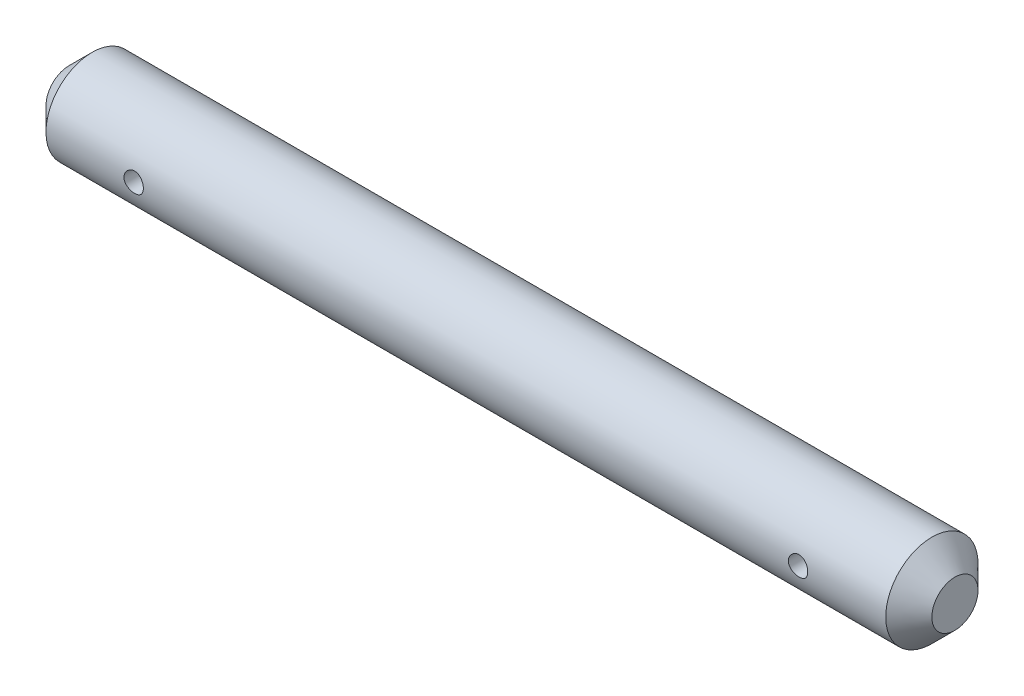
ISO-10303-21;
HEADER;
FILE_DESCRIPTION(('STEP AP214'),'2;1');
FILE_NAME('part.step','',(''),(''),'','','');
FILE_SCHEMA(('AUTOMOTIVE_DESIGN { 1 0 10303 214 1 1 1 1 }'));
ENDSEC;
DATA;
#1=APPLICATION_CONTEXT('core data for automotive mechanical design processes');
#2=APPLICATION_PROTOCOL_DEFINITION('international standard','automotive_design',2000,#1);
#3=PRODUCT_CONTEXT('',#1,'mechanical');
#4=PRODUCT('Part','Part','',(#3));
#5=PRODUCT_RELATED_PRODUCT_CATEGORY('part','',(#4));
#6=PRODUCT_DEFINITION_FORMATION('','',#4);
#7=PRODUCT_DEFINITION_CONTEXT('part definition',#1,'design');
#8=PRODUCT_DEFINITION('design','',#6,#7);
#9=PRODUCT_DEFINITION_SHAPE('','',#8);
#10=(LENGTH_UNIT() NAMED_UNIT(*) SI_UNIT(.MILLI.,.METRE.));
#11=(NAMED_UNIT(*) PLANE_ANGLE_UNIT() SI_UNIT($,.RADIAN.));
#12=(NAMED_UNIT(*) SI_UNIT($,.STERADIAN.) SOLID_ANGLE_UNIT());
#13=UNCERTAINTY_MEASURE_WITH_UNIT(LENGTH_MEASURE(1.E-05),#10,'distance_accuracy_value','');
#14=(GEOMETRIC_REPRESENTATION_CONTEXT(3) GLOBAL_UNCERTAINTY_ASSIGNED_CONTEXT((#13)) GLOBAL_UNIT_ASSIGNED_CONTEXT((#10,
#11,#12)) REPRESENTATION_CONTEXT('',''));
#15=CARTESIAN_POINT('',(0.,0.,0.));
#16=DIRECTION('',(0.,0.,1.));
#17=DIRECTION('',(1.,0.,0.));
#18=AXIS2_PLACEMENT_3D('',#15,#16,#17);
#19=CARTESIAN_POINT('',(-48.,0.,0.));
#20=DIRECTION('',(-1.,0.,0.));
#21=DIRECTION('',(0.,-1.,0.));
#22=AXIS2_PLACEMENT_3D('',#19,#20,#21);
#23=CYLINDRICAL_SURFACE('',#22,5.);
#24=CARTESIAN_POINT('',(45.5,0.,0.));
#25=DIRECTION('',(1.,0.,0.));
#26=DIRECTION('',(0.,1.,0.));
#27=AXIS2_PLACEMENT_3D('',#24,#25,#26);
#28=CIRCLE('',#27,5.);
#29=CARTESIAN_POINT('',(45.5,5.,0.));
#30=VERTEX_POINT('',#29);
#31=EDGE_CURVE('E51',#30,#30,#28,.F.);
#32=ORIENTED_EDGE('',*,*,#31,.T.);
#33=EDGE_LOOP('',(#32));
#34=FACE_BOUND('',#33,.T.);
#35=CARTESIAN_POINT('',(-45.5,0.,0.));
#36=DIRECTION('',(1.,0.,0.));
#37=DIRECTION('',(0.,1.,0.));
#38=AXIS2_PLACEMENT_3D('',#35,#36,#37);
#39=CIRCLE('',#38,5.);
#40=CARTESIAN_POINT('',(-45.5,5.,0.));
#41=VERTEX_POINT('',#40);
#42=EDGE_CURVE('E55',#41,#41,#39,.T.);
#43=ORIENTED_EDGE('',*,*,#42,.T.);
#44=EDGE_LOOP('',(#43));
#45=FACE_BOUND('',#44,.T.);
#46=CARTESIAN_POINT('',(34.95,0.,-5.));
#47=CARTESIAN_POINT('',(34.9500020670795,-0.0582929242366829,-4.99999892087414));
#48=CARTESIAN_POINT('',(34.9548707746513,-0.116611365509768,-4.99897017169846));
#49=CARTESIAN_POINT('',(34.9741990173519,-0.23159558425754,-4.99496558613183));
#50=CARTESIAN_POINT('',(34.9886657708544,-0.288260084347119,-4.99198828432158));
#51=CARTESIAN_POINT('',(35.0267200745913,-0.3982576954319,-4.98441855072821));
#52=CARTESIAN_POINT('',(35.0502984725063,-0.451594087150226,-4.97982774007421));
#53=CARTESIAN_POINT('',(35.1058785820746,-0.553551149056712,-4.9695281714379));
#54=CARTESIAN_POINT('',(35.1378799416124,-0.602172016257581,-4.96381946019113));
#55=CARTESIAN_POINT('',(35.2099011419673,-0.694042951461575,-4.95181603197298));
#56=CARTESIAN_POINT('',(35.2500220614324,-0.737212900277577,-4.9455145252722));
#57=CARTESIAN_POINT('',(35.336926357596,-0.816262310202856,-4.93308430111514));
#58=CARTESIAN_POINT('',(35.3837102916704,-0.852141160785579,-4.92695559816572));
#59=CARTESIAN_POINT('',(35.4831973295141,-0.915937457501272,-4.91549827175981));
#60=CARTESIAN_POINT('',(35.5359555086942,-0.943770721272677,-4.91017836622675));
#61=CARTESIAN_POINT('',(35.6455301548892,-0.990146102507814,-4.90103795609041));
#62=CARTESIAN_POINT('',(35.7023461764008,-1.00868923813218,-4.89721728718677));
#63=CARTESIAN_POINT('',(35.8175579304258,-1.03569542997195,-4.89157688337261));
#64=CARTESIAN_POINT('',(35.8759191533494,-1.04429973598509,-4.88972913880302));
#65=CARTESIAN_POINT('',(35.9932837965518,-1.05162300397034,-4.88815958427772));
#66=CARTESIAN_POINT('',(36.052287143505,-1.05034308305975,-4.88843753407558));
#67=CARTESIAN_POINT('',(36.1682190613358,-1.03804815221598,-4.89106256175169));
#68=CARTESIAN_POINT('',(36.225165826753,-1.02719619088078,-4.89337498308973));
#69=CARTESIAN_POINT('',(36.3364120546769,-0.996323090753519,-4.89975371630493));
#70=CARTESIAN_POINT('',(36.3907113789727,-0.976301473821875,-4.90382011964053));
#71=CARTESIAN_POINT('',(36.4955852132004,-0.927504854980543,-4.91328339659489));
#72=CARTESIAN_POINT('',(36.5461292215821,-0.898666240724584,-4.91868988305607));
#73=CARTESIAN_POINT('',(36.6417213485943,-0.833099050287869,-4.93021812634629));
#74=CARTESIAN_POINT('',(36.6867687727047,-0.796369478661749,-4.93633997337369));
#75=CARTESIAN_POINT('',(36.7710287413324,-0.715195179306919,-4.94875854842759));
#76=CARTESIAN_POINT('',(36.8101074445863,-0.67061155714214,-4.95505633328249));
#77=CARTESIAN_POINT('',(36.8802539351438,-0.575453612067676,-4.96700603272251));
#78=CARTESIAN_POINT('',(36.9113215984944,-0.524879196481373,-4.97265793731329));
#79=CARTESIAN_POINT('',(36.9645931993866,-0.419018933981055,-4.98269521140964));
#80=CARTESIAN_POINT('',(36.9867806671355,-0.363724561359624,-4.98707822341839));
#81=CARTESIAN_POINT('',(37.0215130492623,-0.250080252056762,-4.99406618254208));
#82=CARTESIAN_POINT('',(37.0340592539025,-0.191730725354514,-4.99667136757323));
#83=CARTESIAN_POINT('',(37.0489607717464,-0.0747814806285939,-4.9997766226025));
#84=CARTESIAN_POINT('',(37.0514990709266,-0.0162060522941173,-5.00031448713233));
#85=CARTESIAN_POINT('',(37.0468071881703,0.100531867341577,-4.99932996439547));
#86=CARTESIAN_POINT('',(37.039577614451,0.158694384126915,-4.99780770540671));
#87=CARTESIAN_POINT('',(37.015707092173,0.272356774731822,-4.99289773376416));
#88=CARTESIAN_POINT('',(36.9991611274063,0.327877481794109,-4.9895288570548));
#89=CARTESIAN_POINT('',(36.9572321505231,0.435355996370233,-4.98130233491784));
#90=CARTESIAN_POINT('',(36.9318484273929,0.487313516816587,-4.97644456971024));
#91=CARTESIAN_POINT('',(36.8725762854505,0.586954628019342,-4.96568540679325));
#92=CARTESIAN_POINT('',(36.8385790946396,0.634572076596089,-4.95977097058188));
#93=CARTESIAN_POINT('',(36.7631894442566,0.723491820275091,-4.94758298765372));
#94=CARTESIAN_POINT('',(36.7217961044215,0.764793362593854,-4.94130939825228));
#95=CARTESIAN_POINT('',(36.6319525545589,0.840624189826654,-4.9289811250728));
#96=CARTESIAN_POINT('',(36.5833949340224,0.875027268233335,-4.92293193044843));
#97=CARTESIAN_POINT('',(36.4810830724301,0.935190004312763,-4.9118590398142));
#98=CARTESIAN_POINT('',(36.4273290493812,0.96095002438902,-4.90683530081044));
#99=CARTESIAN_POINT('',(36.316431644652,1.00292882698657,-4.89842756340699));
#100=CARTESIAN_POINT('',(36.2593086075525,1.01919948621189,-4.89503466774294));
#101=CARTESIAN_POINT('',(36.1430596491353,1.04189240556228,-4.89025532411004));
#102=CARTESIAN_POINT('',(36.0839340208586,1.04831610029383,-4.88886858386559));
#103=CARTESIAN_POINT('',(35.9666281054558,1.05107544496626,-4.88827594643399));
#104=CARTESIAN_POINT('',(35.9084526451606,1.04761086244724,-4.88902686253059));
#105=CARTESIAN_POINT('',(35.7935339467898,1.03113587744834,-4.89252781964505));
#106=CARTESIAN_POINT('',(35.7367906944967,1.01812556976794,-4.89527784080961));
#107=CARTESIAN_POINT('',(35.6264907935825,0.983021491745314,-4.90244691845734));
#108=CARTESIAN_POINT('',(35.5729252418772,0.960954619313949,-4.90686102947481));
#109=CARTESIAN_POINT('',(35.4702262627923,0.908387766965595,-4.91686326664018));
#110=CARTESIAN_POINT('',(35.4210932554725,0.877886988901934,-4.92245150389004));
#111=CARTESIAN_POINT('',(35.3276645094141,0.808646148896298,-4.93430284377157));
#112=CARTESIAN_POINT('',(35.2834762916322,0.76976280292096,-4.94057660404644));
#113=CARTESIAN_POINT('',(35.202186156234,0.685153613351451,-4.95301820370576));
#114=CARTESIAN_POINT('',(35.1650858731601,0.639426195777585,-4.95918601836046));
#115=CARTESIAN_POINT('',(35.0986097957516,0.541779863622078,-4.97080655544604));
#116=CARTESIAN_POINT('',(35.0693299290349,0.489794486766691,-4.9762500197256));
#117=CARTESIAN_POINT('',(35.0199691531916,0.381538980665326,-4.98571655366597));
#118=CARTESIAN_POINT('',(34.9998802525838,0.325272623547498,-4.98974085657711));
#119=CARTESIAN_POINT('',(34.9732006947065,0.224096334074654,-4.99516703145466));
#120=CARTESIAN_POINT('',(34.9645165085656,0.179747916168574,-4.99696846689598));
#121=CARTESIAN_POINT('',(34.9529154705435,0.0902714134666893,-4.99938534645405));
#122=CARTESIAN_POINT('',(34.9499983992069,0.0451433584042559,-5.00000083569946));
#123=CARTESIAN_POINT('',(34.95,0.,-5.));
#124=B_SPLINE_CURVE_WITH_KNOTS('',3,(#46,#47,#48,#49,#50,#51,#52,#53,#54,#55,#56,#57,#58,#59,
#60,#61,#62,#63,#64,#65,#66,#67,#68,#69,#70,#71,#72,#73,#74,#75,#76,#77,#78,#79,#80,#81,#82,#83,
#84,#85,#86,#87,#88,#89,#90,#91,#92,#93,#94,#95,#96,#97,#98,#99,#100,#101,#102,#103,#104,#105,
#106,#107,#108,#109,#110,#111,#112,#113,#114,#115,#116,#117,#118,#119,#120,#121,#122,#123),
.UNSPECIFIED.,.T.,.F.,(4,2,2,2,2,2,2,2,2,2,2,2,2,2,2,2,2,2,2,2,2,2,2,2,2,2,2,2,2,2,2,2,2,2,2,2,
2,2,4),(0.,0.174713575706853,0.349558696902308,0.524228647051034,0.698891296413362,
0.875879239345658,1.05288199641852,1.23167476707106,1.41044793846714,1.58664786689212,
1.76282788145741,1.93606360589124,2.10930836450166,2.28383377579595,2.45838121643624,
2.6363995863867,2.81442071061265,2.99277049128035,3.17109639975504,3.346146221126,
3.52118514315412,3.69447098177818,3.86777076478325,4.0433787480044,4.21900764539434,
4.39760379438033,4.57619245389215,4.7537954199357,4.93137250850286,5.10538764852306,
5.27940106040607,5.45290135168345,5.62641806786615,5.8031764972915,5.97997563974631,
6.15885305066524,6.3375746319438,6.47288192379533,6.60818406671408),.UNSPECIFIED.);
#125=CARTESIAN_POINT('',(34.95,0.,-5.));
#126=VERTEX_POINT('',#125);
#127=EDGE_CURVE('E74',#126,#126,#124,.T.);
#128=ORIENTED_EDGE('',*,*,#127,.T.);
#129=EDGE_LOOP('',(#128));
#130=FACE_BOUND('',#129,.T.);
#131=CARTESIAN_POINT('',(-37.05,0.,-4.99999999999999));
#132=CARTESIAN_POINT('',(-37.0499979329205,-0.0582929242366822,-4.99999892087414));
#133=CARTESIAN_POINT('',(-37.0451292253487,-0.116611365509767,-4.99897017169845));
#134=CARTESIAN_POINT('',(-37.0258009826481,-0.23159558425754,-4.99496558613183));
#135=CARTESIAN_POINT('',(-37.0113342291455,-0.288260084347119,-4.99198828432158));
#136=CARTESIAN_POINT('',(-36.9732799254087,-0.3982576954319,-4.98441855072821));
#137=CARTESIAN_POINT('',(-36.9497015274937,-0.451594087150225,-4.97982774007421));
#138=CARTESIAN_POINT('',(-36.8941214179254,-0.553551149056712,-4.9695281714379));
#139=CARTESIAN_POINT('',(-36.8621200583876,-0.602172016257581,-4.96381946019113));
#140=CARTESIAN_POINT('',(-36.7900988580327,-0.694042951461576,-4.95181603197298));
#141=CARTESIAN_POINT('',(-36.7499779385675,-0.737212900277579,-4.9455145252722));
#142=CARTESIAN_POINT('',(-36.663073642404,-0.816262310202857,-4.93308430111514));
#143=CARTESIAN_POINT('',(-36.6162897083296,-0.852141160785579,-4.92695559816572));
#144=CARTESIAN_POINT('',(-36.5168026704859,-0.915937457501271,-4.91549827175981));
#145=CARTESIAN_POINT('',(-36.4640444913058,-0.943770721272677,-4.91017836622675));
#146=CARTESIAN_POINT('',(-36.3544698451108,-0.990146102507813,-4.90103795609041));
#147=CARTESIAN_POINT('',(-36.2976538235992,-1.00868923813218,-4.89721728718677));
#148=CARTESIAN_POINT('',(-36.1824420695742,-1.03569542997195,-4.89157688337261));
#149=CARTESIAN_POINT('',(-36.1240808466506,-1.04429973598509,-4.88972913880302));
#150=CARTESIAN_POINT('',(-36.0067162034481,-1.05162300397034,-4.88815958427772));
#151=CARTESIAN_POINT('',(-35.947712856495,-1.05034308305975,-4.88843753407558));
#152=CARTESIAN_POINT('',(-35.8317809386642,-1.03804815221598,-4.89106256175169));
#153=CARTESIAN_POINT('',(-35.774834173247,-1.02719619088078,-4.89337498308973));
#154=CARTESIAN_POINT('',(-35.6635879453231,-0.996323090753518,-4.89975371630493));
#155=CARTESIAN_POINT('',(-35.6092886210273,-0.976301473821874,-4.90382011964053));
#156=CARTESIAN_POINT('',(-35.5044147867996,-0.927504854980542,-4.91328339659489));
#157=CARTESIAN_POINT('',(-35.4538707784179,-0.898666240724583,-4.91868988305607));
#158=CARTESIAN_POINT('',(-35.3582786514057,-0.833099050287868,-4.93021812634629));
#159=CARTESIAN_POINT('',(-35.3132312272953,-0.796369478661749,-4.93633997337369));
#160=CARTESIAN_POINT('',(-35.2289712586676,-0.715195179306918,-4.9487585484276));
#161=CARTESIAN_POINT('',(-35.1898925554137,-0.670611557142139,-4.95505633328249));
#162=CARTESIAN_POINT('',(-35.1197460648562,-0.575453612067675,-4.96700603272251));
#163=CARTESIAN_POINT('',(-35.0886784015056,-0.524879196481372,-4.97265793731329));
#164=CARTESIAN_POINT('',(-35.0354068006134,-0.419018933981054,-4.98269521140964));
#165=CARTESIAN_POINT('',(-35.0132193328645,-0.363724561359623,-4.98707822341839));
#166=CARTESIAN_POINT('',(-34.9784869507377,-0.250080252056761,-4.99406618254208));
#167=CARTESIAN_POINT('',(-34.9659407460975,-0.191730725354513,-4.99667136757323));
#168=CARTESIAN_POINT('',(-34.9510392282536,-0.0747814806285926,-4.9997766226025));
#169=CARTESIAN_POINT('',(-34.9485009290734,-0.0162060522941158,-5.00031448713233));
#170=CARTESIAN_POINT('',(-34.9531928118297,0.100531867341579,-4.99932996439547));
#171=CARTESIAN_POINT('',(-34.960422385549,0.158694384126917,-4.99780770540671));
#172=CARTESIAN_POINT('',(-34.984292907827,0.272356774731823,-4.99289773376416));
#173=CARTESIAN_POINT('',(-35.0008388725937,0.327877481794112,-4.9895288570548));
#174=CARTESIAN_POINT('',(-35.0427678494769,0.435355996370235,-4.98130233491784));
#175=CARTESIAN_POINT('',(-35.0681515726071,0.487313516816589,-4.97644456971024));
#176=CARTESIAN_POINT('',(-35.1274237145495,0.586954628019345,-4.96568540679325));
#177=CARTESIAN_POINT('',(-35.1614209053604,0.634572076596095,-4.95977097058188));
#178=CARTESIAN_POINT('',(-35.2368105557434,0.723491820275097,-4.94758298765372));
#179=CARTESIAN_POINT('',(-35.2782038955785,0.764793362593858,-4.94130939825228));
#180=CARTESIAN_POINT('',(-35.3680474454411,0.840624189826656,-4.9289811250728));
#181=CARTESIAN_POINT('',(-35.4166050659776,0.875027268233336,-4.92293193044843));
#182=CARTESIAN_POINT('',(-35.5189169275699,0.935190004312764,-4.9118590398142));
#183=CARTESIAN_POINT('',(-35.5726709506188,0.960950024389021,-4.90683530081044));
#184=CARTESIAN_POINT('',(-35.683568355348,1.00292882698658,-4.89842756340699));
#185=CARTESIAN_POINT('',(-35.7406913924475,1.0191994862119,-4.89503466774294));
#186=CARTESIAN_POINT('',(-35.8569403508647,1.04189240556228,-4.89025532411004));
#187=CARTESIAN_POINT('',(-35.9160659791414,1.04831610029384,-4.88886858386559));
#188=CARTESIAN_POINT('',(-36.0333718945442,1.05107544496626,-4.88827594643399));
#189=CARTESIAN_POINT('',(-36.0915473548394,1.04761086244724,-4.88902686253059));
#190=CARTESIAN_POINT('',(-36.2064660532102,1.03113587744834,-4.89252781964505));
#191=CARTESIAN_POINT('',(-36.2632093055033,1.01812556976793,-4.89527784080961));
#192=CARTESIAN_POINT('',(-36.3735092064175,0.983021491745313,-4.90244691845734));
#193=CARTESIAN_POINT('',(-36.4270747581228,0.960954619313947,-4.90686102947481));
#194=CARTESIAN_POINT('',(-36.5297737372077,0.908387766965592,-4.91686326664018));
#195=CARTESIAN_POINT('',(-36.5789067445275,0.877886988901933,-4.92245150389004));
#196=CARTESIAN_POINT('',(-36.6723354905859,0.808646148896299,-4.93430284377158));
#197=CARTESIAN_POINT('',(-36.7165237083678,0.76976280292096,-4.94057660404644));
#198=CARTESIAN_POINT('',(-36.797813843766,0.685153613351451,-4.95301820370576));
#199=CARTESIAN_POINT('',(-36.8349141268399,0.639426195777586,-4.95918601836046));
#200=CARTESIAN_POINT('',(-36.9013902042484,0.541779863622079,-4.97080655544604));
#201=CARTESIAN_POINT('',(-36.9306700709651,0.489794486766692,-4.9762500197256));
#202=CARTESIAN_POINT('',(-36.9800308468084,0.381538980665327,-4.98571655366597));
#203=CARTESIAN_POINT('',(-37.0001197474162,0.325272623547499,-4.98974085657711));
#204=CARTESIAN_POINT('',(-37.0267993052935,0.224096334074655,-4.99516703145466));
#205=CARTESIAN_POINT('',(-37.0354834914344,0.179747916168575,-4.99696846689598));
#206=CARTESIAN_POINT('',(-37.0470845294564,0.0902714134666903,-4.99938534645405));
#207=CARTESIAN_POINT('',(-37.0500016007931,0.0451433584042568,-5.00000083569945));
#208=CARTESIAN_POINT('',(-37.05,0.,-4.99999999999999));
#209=B_SPLINE_CURVE_WITH_KNOTS('',3,(#131,#132,#133,#134,#135,#136,#137,#138,#139,#140,#141,
#142,#143,#144,#145,#146,#147,#148,#149,#150,#151,#152,#153,#154,#155,#156,#157,#158,#159,#160,
#161,#162,#163,#164,#165,#166,#167,#168,#169,#170,#171,#172,#173,#174,#175,#176,#177,#178,#179,
#180,#181,#182,#183,#184,#185,#186,#187,#188,#189,#190,#191,#192,#193,#194,#195,#196,#197,#198,
#199,#200,#201,#202,#203,#204,#205,#206,#207,#208),.UNSPECIFIED.,.T.,.F.,(4,2,2,2,2,2,2,2,2,2,2,
2,2,2,2,2,2,2,2,2,2,2,2,2,2,2,2,2,2,2,2,2,2,2,2,2,2,2,4),(0.,0.174713575706854,
0.349558696902309,0.524228647051034,0.698891296413363,0.875879239345665,1.05288199641852,
1.23167476707106,1.41044793846714,1.58664786689214,1.76282788145741,1.93606360589124,
2.10930836450166,2.28383377579595,2.45838121643624,2.6363995863867,2.81442071061265,
2.99277049128035,3.17109639975504,3.346146221126,3.52118514315412,3.69447098177818,
3.86777076478325,4.04337874800441,4.21900764539434,4.39760379438033,4.57619245389215,
4.7537954199357,4.93137250850286,5.10538764852307,5.27940106040607,5.45290135168346,
5.62641806786615,5.8031764972915,5.97997563974631,6.15885305066524,6.3375746319438,
6.47288192379533,6.60818406671408),.UNSPECIFIED.);
#210=CARTESIAN_POINT('',(-37.05,0.,-4.99999999999999));
#211=VERTEX_POINT('',#210);
#212=EDGE_CURVE('E73',#211,#211,#209,.T.);
#213=ORIENTED_EDGE('',*,*,#212,.T.);
#214=EDGE_LOOP('',(#213));
#215=FACE_BOUND('',#214,.T.);
#216=CARTESIAN_POINT('',(-37.05,0.,5.00000000000001));
#217=CARTESIAN_POINT('',(-37.0499979329205,0.0582929242366818,4.99999892087415));
#218=CARTESIAN_POINT('',(-37.0451292253487,0.116611365509767,4.99897017169846));
#219=CARTESIAN_POINT('',(-37.0258009826481,0.231595584257539,4.99496558613183));
#220=CARTESIAN_POINT('',(-37.0113342291455,0.288260084347117,4.99198828432157));
#221=CARTESIAN_POINT('',(-36.9732799254087,0.3982576954319,4.98441855072821));
#222=CARTESIAN_POINT('',(-36.9497015274937,0.451594087150228,4.97982774007421));
#223=CARTESIAN_POINT('',(-36.8941214179254,0.553551149056714,4.9695281714379));
#224=CARTESIAN_POINT('',(-36.8621200583876,0.602172016257579,4.96381946019113));
#225=CARTESIAN_POINT('',(-36.7900988580327,0.694042951461571,4.95181603197298));
#226=CARTESIAN_POINT('',(-36.7499779385676,0.737212900277575,4.9455145252722));
#227=CARTESIAN_POINT('',(-36.663073642404,0.816262310202855,4.93308430111514));
#228=CARTESIAN_POINT('',(-36.6162897083296,0.852141160785577,4.92695559816572));
#229=CARTESIAN_POINT('',(-36.5168026704859,0.915937457501272,4.91549827175981));
#230=CARTESIAN_POINT('',(-36.4640444913058,0.943770721272681,4.91017836622675));
#231=CARTESIAN_POINT('',(-36.3544698451108,0.990146102507817,4.90103795609041));
#232=CARTESIAN_POINT('',(-36.2976538235992,1.00868923813218,4.89721728718677));
#233=CARTESIAN_POINT('',(-36.1824420695742,1.03569542997195,4.89157688337261));
#234=CARTESIAN_POINT('',(-36.1240808466506,1.04429973598509,4.88972913880302));
#235=CARTESIAN_POINT('',(-36.0067162034481,1.05162300397034,4.88815958427772));
#236=CARTESIAN_POINT('',(-35.947712856495,1.05034308305975,4.88843753407558));
#237=CARTESIAN_POINT('',(-35.8317809386642,1.03804815221598,4.89106256175169));
#238=CARTESIAN_POINT('',(-35.774834173247,1.02719619088078,4.89337498308973));
#239=CARTESIAN_POINT('',(-35.6635879453231,0.996323090753518,4.89975371630493));
#240=CARTESIAN_POINT('',(-35.6092886210273,0.976301473821874,4.90382011964053));
#241=CARTESIAN_POINT('',(-35.5044147867996,0.927504854980542,4.91328339659489));
#242=CARTESIAN_POINT('',(-35.4538707784179,0.898666240724583,4.91868988305607));
#243=CARTESIAN_POINT('',(-35.3582786514057,0.833099050287868,4.93021812634629));
#244=CARTESIAN_POINT('',(-35.3132312272953,0.796369478661749,4.93633997337369));
#245=CARTESIAN_POINT('',(-35.2289712586676,0.715195179306918,4.9487585484276));
#246=CARTESIAN_POINT('',(-35.1898925554137,0.670611557142139,4.95505633328249));
#247=CARTESIAN_POINT('',(-35.1197460648562,0.575453612067675,4.96700603272251));
#248=CARTESIAN_POINT('',(-35.0886784015056,0.524879196481373,4.97265793731329));
#249=CARTESIAN_POINT('',(-35.0354068006134,0.419018933981055,4.98269521140964));
#250=CARTESIAN_POINT('',(-35.0132193328645,0.363724561359623,4.98707822341839));
#251=CARTESIAN_POINT('',(-34.9784869507377,0.250080252056761,4.99406618254208));
#252=CARTESIAN_POINT('',(-34.9659407460975,0.191730725354513,4.99667136757323));
#253=CARTESIAN_POINT('',(-34.9510392282536,0.074781480628593,4.9997766226025));
#254=CARTESIAN_POINT('',(-34.9485009290734,0.0162060522941166,5.00031448713233));
#255=CARTESIAN_POINT('',(-34.9531928118297,-0.100531867341578,4.99932996439547));
#256=CARTESIAN_POINT('',(-34.960422385549,-0.158694384126916,4.99780770540671));
#257=CARTESIAN_POINT('',(-34.984292907827,-0.272356774731821,4.99289773376416));
#258=CARTESIAN_POINT('',(-35.0008388725937,-0.327877481794109,4.9895288570548));
#259=CARTESIAN_POINT('',(-35.0427678494769,-0.435355996370232,4.98130233491784));
#260=CARTESIAN_POINT('',(-35.0681515726071,-0.487313516816586,4.97644456971024));
#261=CARTESIAN_POINT('',(-35.1274237145495,-0.586954628019341,4.96568540679325));
#262=CARTESIAN_POINT('',(-35.1614209053604,-0.634572076596088,4.95977097058188));
#263=CARTESIAN_POINT('',(-35.2368105557434,-0.723491820275089,4.94758298765372));
#264=CARTESIAN_POINT('',(-35.2782038955785,-0.764793362593851,4.94130939825228));
#265=CARTESIAN_POINT('',(-35.3680474454411,-0.84062418982665,4.9289811250728));
#266=CARTESIAN_POINT('',(-35.4166050659776,-0.875027268233332,4.92293193044843));
#267=CARTESIAN_POINT('',(-35.5189169275699,-0.935190004312763,4.9118590398142));
#268=CARTESIAN_POINT('',(-35.5726709506188,-0.96095002438902,4.90683530081044));
#269=CARTESIAN_POINT('',(-35.683568355348,-1.00292882698657,4.89842756340699));
#270=CARTESIAN_POINT('',(-35.7406913924475,-1.01919948621189,4.89503466774294));
#271=CARTESIAN_POINT('',(-35.8569403508647,-1.04189240556228,4.89025532411004));
#272=CARTESIAN_POINT('',(-35.9160659791414,-1.04831610029384,4.88886858386559));
#273=CARTESIAN_POINT('',(-36.0333718945442,-1.05107544496626,4.88827594643399));
#274=CARTESIAN_POINT('',(-36.0915473548394,-1.04761086244724,4.88902686253059));
#275=CARTESIAN_POINT('',(-36.2064660532102,-1.03113587744834,4.89252781964505));
#276=CARTESIAN_POINT('',(-36.2632093055033,-1.01812556976793,4.89527784080961));
#277=CARTESIAN_POINT('',(-36.3735092064175,-0.983021491745314,4.90244691845734));
#278=CARTESIAN_POINT('',(-36.4270747581228,-0.960954619313948,4.90686102947481));
#279=CARTESIAN_POINT('',(-36.5297737372077,-0.908387766965592,4.91686326664018));
#280=CARTESIAN_POINT('',(-36.5789067445275,-0.877886988901933,4.92245150389004));
#281=CARTESIAN_POINT('',(-36.6723354905859,-0.808646148896299,4.93430284377158));
#282=CARTESIAN_POINT('',(-36.7165237083678,-0.76976280292096,4.94057660404644));
#283=CARTESIAN_POINT('',(-36.797813843766,-0.685153613351451,4.95301820370576));
#284=CARTESIAN_POINT('',(-36.8349141268399,-0.639426195777585,4.95918601836046));
#285=CARTESIAN_POINT('',(-36.9013902042484,-0.541779863622079,4.97080655544604));
#286=CARTESIAN_POINT('',(-36.9306700709651,-0.489794486766691,4.9762500197256));
#287=CARTESIAN_POINT('',(-36.9800308468084,-0.381538980665327,4.98571655366597));
#288=CARTESIAN_POINT('',(-37.0001197474162,-0.325272623547499,4.98974085657711));
#289=CARTESIAN_POINT('',(-37.0267993052935,-0.224096334074655,4.99516703145466));
#290=CARTESIAN_POINT('',(-37.0354834914344,-0.179747916168574,4.99696846689598));
#291=CARTESIAN_POINT('',(-37.0470845294564,-0.09027141346669,4.99938534645405));
#292=CARTESIAN_POINT('',(-37.0500016007931,-0.0451433584042567,5.00000083569946));
#293=CARTESIAN_POINT('',(-37.05,0.,5.00000000000001));
#294=B_SPLINE_CURVE_WITH_KNOTS('',3,(#216,#217,#218,#219,#220,#221,#222,#223,#224,#225,#226,
#227,#228,#229,#230,#231,#232,#233,#234,#235,#236,#237,#238,#239,#240,#241,#242,#243,#244,#245,
#246,#247,#248,#249,#250,#251,#252,#253,#254,#255,#256,#257,#258,#259,#260,#261,#262,#263,#264,
#265,#266,#267,#268,#269,#270,#271,#272,#273,#274,#275,#276,#277,#278,#279,#280,#281,#282,#283,
#284,#285,#286,#287,#288,#289,#290,#291,#292,#293),.UNSPECIFIED.,.T.,.F.,(4,2,2,2,2,2,2,2,2,2,2,
2,2,2,2,2,2,2,2,2,2,2,2,2,2,2,2,2,2,2,2,2,2,2,2,2,2,2,4),(0.,0.174713575706853,
0.349558696902307,0.524228647051038,0.69889129641336,0.875879239345657,1.05288199641852,
1.23167476707107,1.41044793846714,1.58664786689212,1.76282788145741,1.93606360589124,
2.10930836450166,2.28383377579595,2.45838121643624,2.6363995863867,2.81442071061265,
2.99277049128035,3.17109639975504,3.346146221126,3.52118514315412,3.69447098177818,
3.86777076478325,4.0433787480044,4.21900764539434,4.39760379438032,4.57619245389215,
4.75379541993569,4.93137250850286,5.10538764852308,5.27940106040607,5.45290135168347,
5.62641806786615,5.8031764972915,5.97997563974631,6.15885305066524,6.3375746319438,
6.47288192379533,6.60818406671408),.UNSPECIFIED.);
#295=CARTESIAN_POINT('',(-37.05,0.,5.00000000000001));
#296=VERTEX_POINT('',#295);
#297=EDGE_CURVE('E64',#296,#296,#294,.T.);
#298=ORIENTED_EDGE('',*,*,#297,.T.);
#299=EDGE_LOOP('',(#298));
#300=FACE_BOUND('',#299,.T.);
#301=CARTESIAN_POINT('',(34.95,0.,5.));
#302=CARTESIAN_POINT('',(34.9500020670795,0.0582929242366811,4.99999892087414));
#303=CARTESIAN_POINT('',(34.9548707746513,0.116611365509766,4.99897017169846));
#304=CARTESIAN_POINT('',(34.9741990173519,0.231595584257539,4.99496558613183));
#305=CARTESIAN_POINT('',(34.9886657708544,0.288260084347117,4.99198828432158));
#306=CARTESIAN_POINT('',(35.0267200745913,0.398257695431898,4.98441855072821));
#307=CARTESIAN_POINT('',(35.0502984725063,0.451594087150224,4.97982774007421));
#308=CARTESIAN_POINT('',(35.1058785820746,0.553551149056711,4.9695281714379));
#309=CARTESIAN_POINT('',(35.1378799416124,0.602172016257579,4.96381946019113));
#310=CARTESIAN_POINT('',(35.2099011419673,0.694042951461575,4.95181603197298));
#311=CARTESIAN_POINT('',(35.2500220614324,0.737212900277578,4.9455145252722));
#312=CARTESIAN_POINT('',(35.336926357596,0.816262310202856,4.93308430111514));
#313=CARTESIAN_POINT('',(35.3837102916704,0.852141160785578,4.92695559816572));
#314=CARTESIAN_POINT('',(35.4831973295141,0.915937457501269,4.91549827175981));
#315=CARTESIAN_POINT('',(35.5359555086942,0.943770721272674,4.91017836622675));
#316=CARTESIAN_POINT('',(35.6455301548892,0.990146102507811,4.90103795609041));
#317=CARTESIAN_POINT('',(35.7023461764008,1.00868923813218,4.89721728718677));
#318=CARTESIAN_POINT('',(35.8175579304258,1.03569542997195,4.89157688337261));
#319=CARTESIAN_POINT('',(35.8759191533494,1.04429973598509,4.88972913880302));
#320=CARTESIAN_POINT('',(35.9932837965518,1.05162300397033,4.88815958427772));
#321=CARTESIAN_POINT('',(36.052287143505,1.05034308305975,4.88843753407558));
#322=CARTESIAN_POINT('',(36.1682190613358,1.03804815221598,4.89106256175169));
#323=CARTESIAN_POINT('',(36.225165826753,1.02719619088078,4.89337498308973));
#324=CARTESIAN_POINT('',(36.3364120546769,0.996323090753517,4.89975371630493));
#325=CARTESIAN_POINT('',(36.3907113789727,0.976301473821873,4.90382011964053));
#326=CARTESIAN_POINT('',(36.4955852132004,0.927504854980541,4.91328339659489));
#327=CARTESIAN_POINT('',(36.5461292215821,0.898666240724583,4.91868988305607));
#328=CARTESIAN_POINT('',(36.6417213485943,0.833099050287867,4.93021812634629));
#329=CARTESIAN_POINT('',(36.6867687727047,0.796369478661748,4.93633997337369));
#330=CARTESIAN_POINT('',(36.7710287413324,0.715195179306917,4.9487585484276));
#331=CARTESIAN_POINT('',(36.8101074445863,0.670611557142138,4.95505633328249));
#332=CARTESIAN_POINT('',(36.8802539351438,0.575453612067674,4.96700603272251));
#333=CARTESIAN_POINT('',(36.9113215984944,0.524879196481372,4.97265793731329));
#334=CARTESIAN_POINT('',(36.9645931993866,0.419018933981054,4.98269521140964));
#335=CARTESIAN_POINT('',(36.9867806671355,0.363724561359622,4.98707822341839));
#336=CARTESIAN_POINT('',(37.0215130492623,0.25008025205676,4.99406618254208));
#337=CARTESIAN_POINT('',(37.0340592539025,0.191730725354513,4.99667136757323));
#338=CARTESIAN_POINT('',(37.0489607717464,0.0747814806285923,4.9997766226025));
#339=CARTESIAN_POINT('',(37.0514990709266,0.0162060522941158,5.00031448713233));
#340=CARTESIAN_POINT('',(37.0468071881703,-0.100531867341579,4.99932996439547));
#341=CARTESIAN_POINT('',(37.039577614451,-0.158694384126917,4.99780770540671));
#342=CARTESIAN_POINT('',(37.015707092173,-0.272356774731823,4.99289773376416));
#343=CARTESIAN_POINT('',(36.9991611274063,-0.32787748179411,4.9895288570548));
#344=CARTESIAN_POINT('',(36.9572321505231,-0.435355996370233,4.98130233491784));
#345=CARTESIAN_POINT('',(36.9318484273929,-0.487313516816588,4.97644456971024));
#346=CARTESIAN_POINT('',(36.8725762854505,-0.586954628019343,4.96568540679325));
#347=CARTESIAN_POINT('',(36.8385790946396,-0.63457207659609,4.95977097058188));
#348=CARTESIAN_POINT('',(36.7631894442566,-0.723491820275093,4.94758298765372));
#349=CARTESIAN_POINT('',(36.7217961044215,-0.764793362593856,4.94130939825228));
#350=CARTESIAN_POINT('',(36.6319525545589,-0.840624189826656,4.9289811250728));
#351=CARTESIAN_POINT('',(36.5833949340224,-0.875027268233337,4.92293193044843));
#352=CARTESIAN_POINT('',(36.4810830724301,-0.935190004312765,4.9118590398142));
#353=CARTESIAN_POINT('',(36.4273290493812,-0.960950024389022,4.90683530081044));
#354=CARTESIAN_POINT('',(36.316431644652,-1.00292882698658,4.89842756340698));
#355=CARTESIAN_POINT('',(36.2593086075525,-1.0191994862119,4.89503466774294));
#356=CARTESIAN_POINT('',(36.1430596491353,-1.04189240556228,4.89025532411003));
#357=CARTESIAN_POINT('',(36.0839340208586,-1.04831610029384,4.88886858386559));
#358=CARTESIAN_POINT('',(35.9666281054558,-1.05107544496626,4.88827594643399));
#359=CARTESIAN_POINT('',(35.9084526451606,-1.04761086244724,4.88902686253059));
#360=CARTESIAN_POINT('',(35.7935339467898,-1.03113587744834,4.89252781964505));
#361=CARTESIAN_POINT('',(35.7367906944967,-1.01812556976794,4.89527784080961));
#362=CARTESIAN_POINT('',(35.6264907935825,-0.983021491745315,4.90244691845734));
#363=CARTESIAN_POINT('',(35.5729252418772,-0.960954619313951,4.90686102947481));
#364=CARTESIAN_POINT('',(35.4702262627923,-0.908387766965597,4.91686326664018));
#365=CARTESIAN_POINT('',(35.4210932554725,-0.877886988901936,4.92245150389004));
#366=CARTESIAN_POINT('',(35.3276645094141,-0.8086461488963,4.93430284377157));
#367=CARTESIAN_POINT('',(35.2834762916322,-0.769762802920962,4.94057660404644));
#368=CARTESIAN_POINT('',(35.202186156234,-0.685153613351452,4.95301820370576));
#369=CARTESIAN_POINT('',(35.1650858731601,-0.639426195777586,4.95918601836045));
#370=CARTESIAN_POINT('',(35.0986097957516,-0.54177986362208,4.97080655544604));
#371=CARTESIAN_POINT('',(35.0693299290349,-0.489794486766692,4.9762500197256));
#372=CARTESIAN_POINT('',(35.0199691531916,-0.381538980665328,4.98571655366597));
#373=CARTESIAN_POINT('',(34.9998802525838,-0.3252726235475,4.98974085657711));
#374=CARTESIAN_POINT('',(34.9732006947065,-0.224096334074656,4.99516703145466));
#375=CARTESIAN_POINT('',(34.9645165085656,-0.179747916168576,4.99696846689598));
#376=CARTESIAN_POINT('',(34.9529154705435,-0.0902714134666914,4.99938534645405));
#377=CARTESIAN_POINT('',(34.9499983992069,-0.0451433584042578,5.00000083569946));
#378=CARTESIAN_POINT('',(34.95,0.,5.));
#379=B_SPLINE_CURVE_WITH_KNOTS('',3,(#301,#302,#303,#304,#305,#306,#307,#308,#309,#310,#311,
#312,#313,#314,#315,#316,#317,#318,#319,#320,#321,#322,#323,#324,#325,#326,#327,#328,#329,#330,
#331,#332,#333,#334,#335,#336,#337,#338,#339,#340,#341,#342,#343,#344,#345,#346,#347,#348,#349,
#350,#351,#352,#353,#354,#355,#356,#357,#358,#359,#360,#361,#362,#363,#364,#365,#366,#367,#368,
#369,#370,#371,#372,#373,#374,#375,#376,#377,#378),.UNSPECIFIED.,.T.,.F.,(4,2,2,2,2,2,2,2,2,2,2,
2,2,2,2,2,2,2,2,2,2,2,2,2,2,2,2,2,2,2,2,2,2,2,2,2,2,2,4),(0.,0.174713575706854,
0.349558696902308,0.524228647051034,0.698891296413362,0.875879239345665,1.05288199641852,
1.23167476707105,1.41044793846714,1.58664786689212,1.76282788145741,1.93606360589124,
2.10930836450166,2.28383377579595,2.45838121643624,2.6363995863867,2.81442071061265,
2.99277049128035,3.17109639975504,3.346146221126,3.52118514315412,3.69447098177817,
3.86777076478325,4.0433787480044,4.21900764539434,4.39760379438033,4.57619245389215,
4.7537954199357,4.93137250850286,5.10538764852306,5.27940106040607,5.45290135168345,
5.62641806786615,5.8031764972915,5.97997563974631,6.15885305066524,6.3375746319438,
6.47288192379533,6.60818406671408),.UNSPECIFIED.);
#380=CARTESIAN_POINT('',(34.95,0.,5.));
#381=VERTEX_POINT('',#380);
#382=EDGE_CURVE('E65',#381,#381,#379,.T.);
#383=ORIENTED_EDGE('',*,*,#382,.T.);
#384=EDGE_LOOP('',(#383));
#385=FACE_BOUND('',#384,.T.);
#386=ADVANCED_FACE('F43',(#34,#45,#130,#215,#300,#385),#23,.T.);
#387=CARTESIAN_POINT('',(-48.,0.,0.));
#388=DIRECTION('',(1.,0.,0.));
#389=DIRECTION('',(0.,1.,0.));
#390=AXIS2_PLACEMENT_3D('',#387,#388,#389);
#391=PLANE('',#390);
#392=CARTESIAN_POINT('',(-48.,0.,0.));
#393=DIRECTION('',(1.,0.,0.));
#394=DIRECTION('',(0.,1.,0.));
#395=AXIS2_PLACEMENT_3D('',#392,#393,#394);
#396=CIRCLE('',#395,2.5);
#397=CARTESIAN_POINT('',(-48.,2.5,0.));
#398=VERTEX_POINT('',#397);
#399=EDGE_CURVE('E59',#398,#398,#396,.F.);
#400=ORIENTED_EDGE('',*,*,#399,.T.);
#401=EDGE_LOOP('',(#400));
#402=FACE_BOUND('',#401,.T.);
#403=ADVANCED_FACE('F109',(#402),#391,.F.);
#404=CARTESIAN_POINT('',(48.,0.,0.));
#405=DIRECTION('',(1.,0.,0.));
#406=DIRECTION('',(0.,1.,0.));
#407=AXIS2_PLACEMENT_3D('',#404,#405,#406);
#408=PLANE('',#407);
#409=CARTESIAN_POINT('',(48.,0.,0.));
#410=DIRECTION('',(1.,0.,0.));
#411=DIRECTION('',(0.,1.,0.));
#412=AXIS2_PLACEMENT_3D('',#409,#410,#411);
#413=CIRCLE('',#412,2.5);
#414=CARTESIAN_POINT('',(48.,2.5,0.));
#415=VERTEX_POINT('',#414);
#416=EDGE_CURVE('E10',#415,#415,#413,.T.);
#417=ORIENTED_EDGE('',*,*,#416,.T.);
#418=EDGE_LOOP('',(#417));
#419=FACE_BOUND('',#418,.T.);
#420=ADVANCED_FACE('F91',(#419),#408,.T.);
#421=CARTESIAN_POINT('',(-36.,0.,41.));
#422=DIRECTION('',(0.,0.,-1.));
#423=DIRECTION('',(-1.,0.,0.));
#424=AXIS2_PLACEMENT_3D('',#421,#422,#423);
#425=CYLINDRICAL_SURFACE('',#424,1.05);
#426=ORIENTED_EDGE('',*,*,#297,.F.);
#427=EDGE_LOOP('',(#426));
#428=FACE_BOUND('',#427,.T.);
#429=ORIENTED_EDGE('',*,*,#212,.F.);
#430=EDGE_LOOP('',(#429));
#431=FACE_BOUND('',#430,.T.);
#432=ADVANCED_FACE('F86',(#428,#431),#425,.F.);
#433=CARTESIAN_POINT('',(36.,0.,20.));
#434=DIRECTION('',(0.,0.,-1.));
#435=DIRECTION('',(-1.,0.,0.));
#436=AXIS2_PLACEMENT_3D('',#433,#434,#435);
#437=CYLINDRICAL_SURFACE('',#436,1.05);
#438=ORIENTED_EDGE('',*,*,#382,.F.);
#439=EDGE_LOOP('',(#438));
#440=FACE_BOUND('',#439,.T.);
#441=ORIENTED_EDGE('',*,*,#127,.F.);
#442=EDGE_LOOP('',(#441));
#443=FACE_BOUND('',#442,.T.);
#444=ADVANCED_FACE('F82',(#440,#443),#437,.F.);
#445=CARTESIAN_POINT('',(-48.,0.,0.));
#446=DIRECTION('',(1.,0.,0.));
#447=DIRECTION('',(0.,1.,0.));
#448=AXIS2_PLACEMENT_3D('',#445,#446,#447);
#449=CONICAL_SURFACE('',#448,2.5,0.785398163397445);
#450=ORIENTED_EDGE('',*,*,#42,.F.);
#451=EDGE_LOOP('',(#450));
#452=FACE_BOUND('',#451,.T.);
#453=ORIENTED_EDGE('',*,*,#399,.F.);
#454=EDGE_LOOP('',(#453));
#455=FACE_BOUND('',#454,.T.);
#456=ADVANCED_FACE('F85',(#452,#455),#449,.T.);
#457=CARTESIAN_POINT('',(45.5,0.,0.));
#458=DIRECTION('',(-1.,0.,0.));
#459=DIRECTION('',(0.,-1.,0.));
#460=AXIS2_PLACEMENT_3D('',#457,#458,#459);
#461=CONICAL_SURFACE('',#460,5.,0.785398163397445);
#462=ORIENTED_EDGE('',*,*,#416,.F.);
#463=EDGE_LOOP('',(#462));
#464=FACE_BOUND('',#463,.T.);
#465=ORIENTED_EDGE('',*,*,#31,.F.);
#466=EDGE_LOOP('',(#465));
#467=FACE_BOUND('',#466,.T.);
#468=ADVANCED_FACE('F46',(#464,#467),#461,.T.);
#469=CLOSED_SHELL('',(#386,#403,#420,#432,#444,#456,#468));
#470=MANIFOLD_SOLID_BREP('B2',#469);
#471=ADVANCED_BREP_SHAPE_REPRESENTATION('',(#18,#470),#14);
#472=SHAPE_DEFINITION_REPRESENTATION(#9,#471);
ENDSEC;
END-ISO-10303-21;
